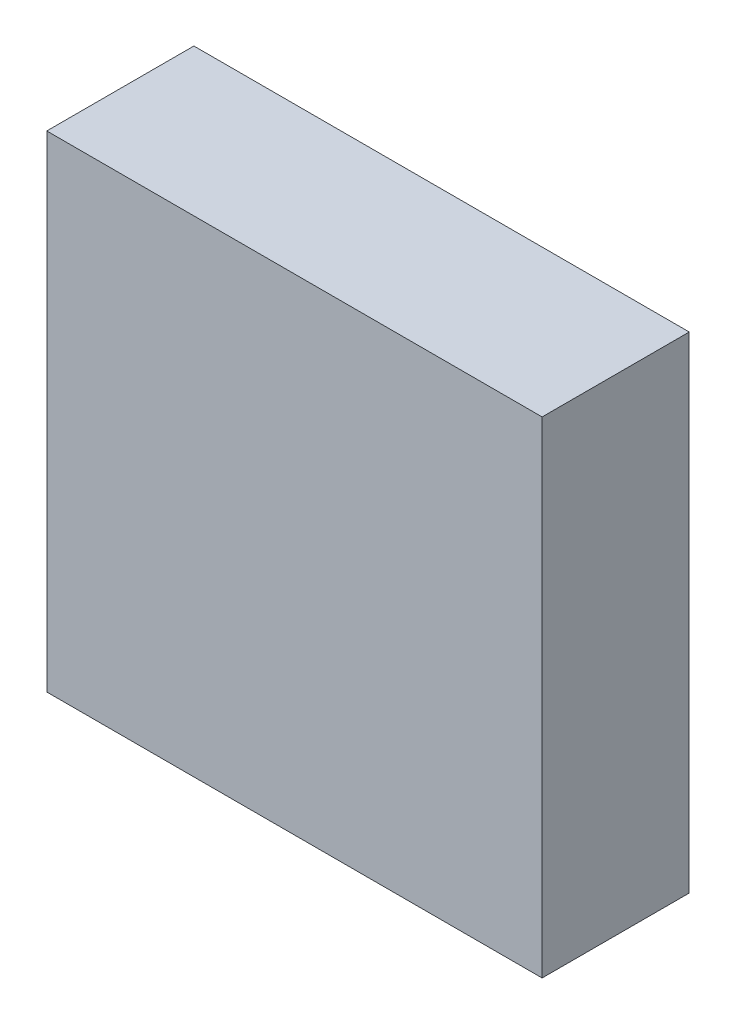
ISO-10303-21;
HEADER;
FILE_DESCRIPTION(('STEP AP214'),'2;1');
FILE_NAME('part.step','',(''),(''),'','','');
FILE_SCHEMA(('AUTOMOTIVE_DESIGN { 1 0 10303 214 1 1 1 1 }'));
ENDSEC;
DATA;
#1=APPLICATION_CONTEXT('core data for automotive mechanical design processes');
#2=APPLICATION_PROTOCOL_DEFINITION('international standard','automotive_design',2000,#1);
#3=PRODUCT_CONTEXT('',#1,'mechanical');
#4=PRODUCT('Part','Part','',(#3));
#5=PRODUCT_RELATED_PRODUCT_CATEGORY('part','',(#4));
#6=PRODUCT_DEFINITION_FORMATION('','',#4);
#7=PRODUCT_DEFINITION_CONTEXT('part definition',#1,'design');
#8=PRODUCT_DEFINITION('design','',#6,#7);
#9=PRODUCT_DEFINITION_SHAPE('','',#8);
#10=(LENGTH_UNIT() NAMED_UNIT(*) SI_UNIT(.MILLI.,.METRE.));
#11=(NAMED_UNIT(*) PLANE_ANGLE_UNIT() SI_UNIT($,.RADIAN.));
#12=(NAMED_UNIT(*) SI_UNIT($,.STERADIAN.) SOLID_ANGLE_UNIT());
#13=UNCERTAINTY_MEASURE_WITH_UNIT(LENGTH_MEASURE(1.E-05),#10,'distance_accuracy_value','');
#14=(GEOMETRIC_REPRESENTATION_CONTEXT(3) GLOBAL_UNCERTAINTY_ASSIGNED_CONTEXT((#13)) GLOBAL_UNIT_ASSIGNED_CONTEXT((#10,
#11,#12)) REPRESENTATION_CONTEXT('',''));
#15=CARTESIAN_POINT('',(0.,0.,0.));
#16=DIRECTION('',(0.,0.,1.));
#17=DIRECTION('',(1.,0.,0.));
#18=AXIS2_PLACEMENT_3D('',#15,#16,#17);
#19=CARTESIAN_POINT('',(0.,0.,10.9));
#20=DIRECTION('',(1.,0.,0.));
#21=DIRECTION('',(0.,0.,-1.));
#22=AXIS2_PLACEMENT_3D('',#19,#20,#21);
#23=PLANE('',#22);
#24=DIRECTION('',(0.,-1.,0.));
#25=VECTOR('',#24,1.);
#26=CARTESIAN_POINT('',(0.,0.,0.));
#27=LINE('',#26,#25);
#28=CARTESIAN_POINT('',(0.,36.,0.));
#29=VERTEX_POINT('',#28);
#30=CARTESIAN_POINT('',(0.,0.,0.));
#31=VERTEX_POINT('',#30);
#32=EDGE_CURVE('E96',#29,#31,#27,.T.);
#33=ORIENTED_EDGE('',*,*,#32,.T.);
#34=DIRECTION('',(0.,0.,-1.));
#35=VECTOR('',#34,1.);
#36=CARTESIAN_POINT('',(0.,0.,10.9));
#37=LINE('',#36,#35);
#38=CARTESIAN_POINT('',(0.,0.,10.9));
#39=VERTEX_POINT('',#38);
#40=EDGE_CURVE('E11',#39,#31,#37,.T.);
#41=ORIENTED_EDGE('',*,*,#40,.F.);
#42=DIRECTION('',(0.,-1.,0.));
#43=VECTOR('',#42,1.);
#44=CARTESIAN_POINT('',(0.,0.,10.9));
#45=LINE('',#44,#43);
#46=CARTESIAN_POINT('',(0.,36.,10.9));
#47=VERTEX_POINT('',#46);
#48=EDGE_CURVE('E84',#47,#39,#45,.T.);
#49=ORIENTED_EDGE('',*,*,#48,.F.);
#50=DIRECTION('',(0.,0.,-1.));
#51=VECTOR('',#50,1.);
#52=CARTESIAN_POINT('',(0.,36.,10.9));
#53=LINE('',#52,#51);
#54=EDGE_CURVE('E92',#47,#29,#53,.T.);
#55=ORIENTED_EDGE('',*,*,#54,.T.);
#56=EDGE_LOOP('',(#33,#41,#49,#55));
#57=FACE_BOUND('',#56,.T.);
#58=ADVANCED_FACE('F33',(#57),#23,.F.);
#59=CARTESIAN_POINT('',(0.,0.,10.9));
#60=DIRECTION('',(0.,1.,0.));
#61=DIRECTION('',(0.,0.,1.));
#62=AXIS2_PLACEMENT_3D('',#59,#60,#61);
#63=PLANE('',#62);
#64=DIRECTION('',(1.,0.,0.));
#65=VECTOR('',#64,1.);
#66=CARTESIAN_POINT('',(0.,0.,0.));
#67=LINE('',#66,#65);
#68=CARTESIAN_POINT('',(36.7,0.,0.));
#69=VERTEX_POINT('',#68);
#70=EDGE_CURVE('E88',#31,#69,#67,.T.);
#71=ORIENTED_EDGE('',*,*,#70,.T.);
#72=DIRECTION('',(0.,0.,-1.));
#73=VECTOR('',#72,1.);
#74=CARTESIAN_POINT('',(36.7,0.,10.9));
#75=LINE('',#74,#73);
#76=CARTESIAN_POINT('',(36.7,0.,10.9));
#77=VERTEX_POINT('',#76);
#78=EDGE_CURVE('E41',#77,#69,#75,.T.);
#79=ORIENTED_EDGE('',*,*,#78,.F.);
#80=DIRECTION('',(1.,0.,0.));
#81=VECTOR('',#80,1.);
#82=CARTESIAN_POINT('',(0.,0.,10.9));
#83=LINE('',#82,#81);
#84=EDGE_CURVE('E79',#39,#77,#83,.T.);
#85=ORIENTED_EDGE('',*,*,#84,.F.);
#86=ORIENTED_EDGE('',*,*,#40,.T.);
#87=EDGE_LOOP('',(#71,#79,#85,#86));
#88=FACE_BOUND('',#87,.T.);
#89=ADVANCED_FACE('F87',(#88),#63,.F.);
#90=CARTESIAN_POINT('',(36.7,0.,10.9));
#91=DIRECTION('',(-1.,0.,0.));
#92=DIRECTION('',(0.,0.,1.));
#93=AXIS2_PLACEMENT_3D('',#90,#91,#92);
#94=PLANE('',#93);
#95=DIRECTION('',(0.,1.,0.));
#96=VECTOR('',#95,1.);
#97=CARTESIAN_POINT('',(36.7,0.,0.));
#98=LINE('',#97,#96);
#99=CARTESIAN_POINT('',(36.7,36.,0.));
#100=VERTEX_POINT('',#99);
#101=EDGE_CURVE('E66',#69,#100,#98,.T.);
#102=ORIENTED_EDGE('',*,*,#101,.T.);
#103=DIRECTION('',(0.,0.,-1.));
#104=VECTOR('',#103,1.);
#105=CARTESIAN_POINT('',(36.7,36.,10.9));
#106=LINE('',#105,#104);
#107=CARTESIAN_POINT('',(36.7,36.,10.9));
#108=VERTEX_POINT('',#107);
#109=EDGE_CURVE('E89',#108,#100,#106,.T.);
#110=ORIENTED_EDGE('',*,*,#109,.F.);
#111=DIRECTION('',(0.,1.,0.));
#112=VECTOR('',#111,1.);
#113=CARTESIAN_POINT('',(36.7,0.,10.9));
#114=LINE('',#113,#112);
#115=EDGE_CURVE('E82',#77,#108,#114,.T.);
#116=ORIENTED_EDGE('',*,*,#115,.F.);
#117=ORIENTED_EDGE('',*,*,#78,.T.);
#118=EDGE_LOOP('',(#102,#110,#116,#117));
#119=FACE_BOUND('',#118,.T.);
#120=ADVANCED_FACE('F90',(#119),#94,.F.);
#121=CARTESIAN_POINT('',(0.,36.,10.9));
#122=DIRECTION('',(0.,-1.,0.));
#123=DIRECTION('',(0.,0.,-1.));
#124=AXIS2_PLACEMENT_3D('',#121,#122,#123);
#125=PLANE('',#124);
#126=DIRECTION('',(-1.,0.,0.));
#127=VECTOR('',#126,1.);
#128=CARTESIAN_POINT('',(0.,36.,0.));
#129=LINE('',#128,#127);
#130=EDGE_CURVE('E72',#100,#29,#129,.T.);
#131=ORIENTED_EDGE('',*,*,#130,.T.);
#132=ORIENTED_EDGE('',*,*,#54,.F.);
#133=DIRECTION('',(-1.,0.,0.));
#134=VECTOR('',#133,1.);
#135=CARTESIAN_POINT('',(0.,36.,10.9));
#136=LINE('',#135,#134);
#137=EDGE_CURVE('E49',#108,#47,#136,.T.);
#138=ORIENTED_EDGE('',*,*,#137,.F.);
#139=ORIENTED_EDGE('',*,*,#109,.T.);
#140=EDGE_LOOP('',(#131,#132,#138,#139));
#141=FACE_BOUND('',#140,.T.);
#142=ADVANCED_FACE('F103',(#141),#125,.F.);
#143=CARTESIAN_POINT('',(0.,0.,10.9));
#144=DIRECTION('',(0.,0.,-1.));
#145=DIRECTION('',(-1.,0.,0.));
#146=AXIS2_PLACEMENT_3D('',#143,#144,#145);
#147=PLANE('',#146);
#148=ORIENTED_EDGE('',*,*,#48,.T.);
#149=ORIENTED_EDGE('',*,*,#84,.T.);
#150=ORIENTED_EDGE('',*,*,#115,.T.);
#151=ORIENTED_EDGE('',*,*,#137,.T.);
#152=EDGE_LOOP('',(#148,#149,#150,#151));
#153=FACE_BOUND('',#152,.T.);
#154=ADVANCED_FACE('F80',(#153),#147,.F.);
#155=CARTESIAN_POINT('',(0.,0.,0.));
#156=DIRECTION('',(0.,0.,-1.));
#157=DIRECTION('',(-1.,0.,0.));
#158=AXIS2_PLACEMENT_3D('',#155,#156,#157);
#159=PLANE('',#158);
#160=ORIENTED_EDGE('',*,*,#32,.F.);
#161=ORIENTED_EDGE('',*,*,#130,.F.);
#162=ORIENTED_EDGE('',*,*,#101,.F.);
#163=ORIENTED_EDGE('',*,*,#70,.F.);
#164=EDGE_LOOP('',(#160,#161,#162,#163));
#165=FACE_BOUND('',#164,.T.);
#166=ADVANCED_FACE('F106',(#165),#159,.T.);
#167=CLOSED_SHELL('',(#58,#89,#120,#142,#154,#166));
#168=MANIFOLD_SOLID_BREP('B2',#167);
#169=ADVANCED_BREP_SHAPE_REPRESENTATION('',(#18,#168),#14);
#170=SHAPE_DEFINITION_REPRESENTATION(#9,#169);
ENDSEC;
END-ISO-10303-21;
